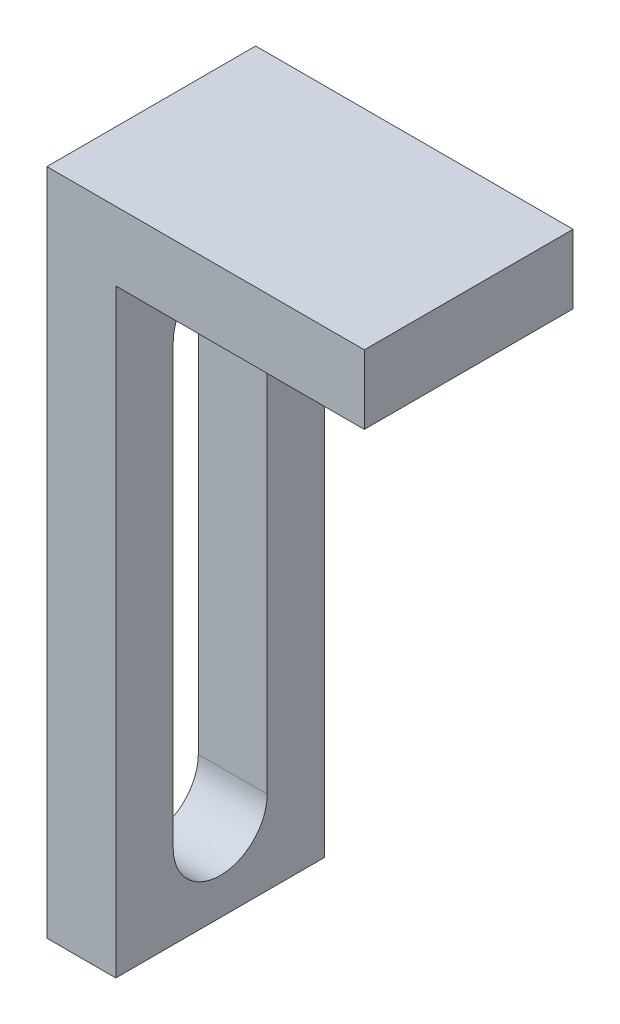
ISO-10303-21;
HEADER;
FILE_DESCRIPTION(('STEP AP214'),'2;1');
FILE_NAME('part.step','',(''),(''),'','','');
FILE_SCHEMA(('AUTOMOTIVE_DESIGN { 1 0 10303 214 1 1 1 1 }'));
ENDSEC;
DATA;
#1=APPLICATION_CONTEXT('core data for automotive mechanical design processes');
#2=APPLICATION_PROTOCOL_DEFINITION('international standard','automotive_design',2000,#1);
#3=PRODUCT_CONTEXT('',#1,'mechanical');
#4=PRODUCT('Part','Part','',(#3));
#5=PRODUCT_RELATED_PRODUCT_CATEGORY('part','',(#4));
#6=PRODUCT_DEFINITION_FORMATION('','',#4);
#7=PRODUCT_DEFINITION_CONTEXT('part definition',#1,'design');
#8=PRODUCT_DEFINITION('design','',#6,#7);
#9=PRODUCT_DEFINITION_SHAPE('','',#8);
#10=(LENGTH_UNIT() NAMED_UNIT(*) SI_UNIT(.MILLI.,.METRE.));
#11=(NAMED_UNIT(*) PLANE_ANGLE_UNIT() SI_UNIT($,.RADIAN.));
#12=(NAMED_UNIT(*) SI_UNIT($,.STERADIAN.) SOLID_ANGLE_UNIT());
#13=UNCERTAINTY_MEASURE_WITH_UNIT(LENGTH_MEASURE(1.E-05),#10,'distance_accuracy_value','');
#14=(GEOMETRIC_REPRESENTATION_CONTEXT(3) GLOBAL_UNCERTAINTY_ASSIGNED_CONTEXT((#13)) GLOBAL_UNIT_ASSIGNED_CONTEXT((#10,
#11,#12)) REPRESENTATION_CONTEXT('',''));
#15=CARTESIAN_POINT('',(0.,0.,0.));
#16=DIRECTION('',(0.,0.,1.));
#17=DIRECTION('',(1.,0.,0.));
#18=AXIS2_PLACEMENT_3D('',#15,#16,#17);
#19=CARTESIAN_POINT('',(-10.3050847457627,-21.6949152542373,10.));
#20=DIRECTION('',(-1.,0.,0.));
#21=DIRECTION('',(0.,0.,1.));
#22=AXIS2_PLACEMENT_3D('',#19,#20,#21);
#23=PLANE('',#22);
#24=CARTESIAN_POINT('',(-10.3050847457627,3.30508474576272,5.));
#25=DIRECTION('',(-1.,0.,0.));
#26=DIRECTION('',(0.,0.,1.));
#27=AXIS2_PLACEMENT_3D('',#24,#25,#26);
#28=CIRCLE('',#27,2.25);
#29=CARTESIAN_POINT('',(-10.3050847457627,3.30508474576272,7.25));
#30=VERTEX_POINT('',#29);
#31=CARTESIAN_POINT('',(-10.3050847457627,3.30508474576272,2.75));
#32=VERTEX_POINT('',#31);
#33=EDGE_CURVE('E58',#30,#32,#28,.T.);
#34=ORIENTED_EDGE('',*,*,#33,.F.);
#35=DIRECTION('',(0.,1.,0.));
#36=VECTOR('',#35,1.);
#37=CARTESIAN_POINT('',(-10.3050847457627,3.30508474576272,7.25));
#38=LINE('',#37,#36);
#39=CARTESIAN_POINT('',(-10.3050847457627,-17.6949152542373,7.25));
#40=VERTEX_POINT('',#39);
#41=EDGE_CURVE('E140',#40,#30,#38,.T.);
#42=ORIENTED_EDGE('',*,*,#41,.F.);
#43=CARTESIAN_POINT('',(-10.3050847457627,-17.6949152542373,5.));
#44=DIRECTION('',(-1.,0.,0.));
#45=DIRECTION('',(0.,0.,1.));
#46=AXIS2_PLACEMENT_3D('',#43,#44,#45);
#47=CIRCLE('',#46,2.25);
#48=CARTESIAN_POINT('',(-10.3050847457627,-17.6949152542373,2.75));
#49=VERTEX_POINT('',#48);
#50=EDGE_CURVE('E123',#49,#40,#47,.T.);
#51=ORIENTED_EDGE('',*,*,#50,.F.);
#52=DIRECTION('',(0.,-1.,0.));
#53=VECTOR('',#52,1.);
#54=CARTESIAN_POINT('',(-10.3050847457627,3.30508474576272,2.75));
#55=LINE('',#54,#53);
#56=EDGE_CURVE('E133',#32,#49,#55,.T.);
#57=ORIENTED_EDGE('',*,*,#56,.F.);
#58=EDGE_LOOP('',(#34,#42,#51,#57));
#59=FACE_BOUND('',#58,.T.);
#60=DIRECTION('',(0.,1.,0.));
#61=VECTOR('',#60,1.);
#62=CARTESIAN_POINT('',(-10.3050847457627,-21.6949152542373,0.));
#63=LINE('',#62,#61);
#64=CARTESIAN_POINT('',(-10.3050847457627,-21.6949152542373,0.));
#65=VERTEX_POINT('',#64);
#66=CARTESIAN_POINT('',(-10.3050847457627,10.3050847457627,0.));
#67=VERTEX_POINT('',#66);
#68=EDGE_CURVE('E150',#65,#67,#63,.T.);
#69=ORIENTED_EDGE('',*,*,#68,.F.);
#70=DIRECTION('',(0.,0.,-1.));
#71=VECTOR('',#70,1.);
#72=CARTESIAN_POINT('',(-10.3050847457627,-21.6949152542373,10.));
#73=LINE('',#72,#71);
#74=CARTESIAN_POINT('',(-10.3050847457627,-21.6949152542373,10.));
#75=VERTEX_POINT('',#74);
#76=EDGE_CURVE('E199',#75,#65,#73,.T.);
#77=ORIENTED_EDGE('',*,*,#76,.F.);
#78=DIRECTION('',(0.,1.,0.));
#79=VECTOR('',#78,1.);
#80=CARTESIAN_POINT('',(-10.3050847457627,-21.6949152542373,10.));
#81=LINE('',#80,#79);
#82=CARTESIAN_POINT('',(-10.3050847457627,10.3050847457627,10.));
#83=VERTEX_POINT('',#82);
#84=EDGE_CURVE('E155',#75,#83,#81,.T.);
#85=ORIENTED_EDGE('',*,*,#84,.T.);
#86=DIRECTION('',(0.,0.,-1.));
#87=VECTOR('',#86,1.);
#88=CARTESIAN_POINT('',(-10.3050847457627,10.3050847457627,10.));
#89=LINE('',#88,#87);
#90=EDGE_CURVE('E177',#83,#67,#89,.T.);
#91=ORIENTED_EDGE('',*,*,#90,.T.);
#92=EDGE_LOOP('',(#69,#77,#85,#91));
#93=FACE_BOUND('',#92,.T.);
#94=ADVANCED_FACE('F43',(#59,#93),#23,.T.);
#95=CARTESIAN_POINT('',(-10.3050847457627,-21.6949152542373,10.));
#96=DIRECTION('',(0.,1.,0.));
#97=DIRECTION('',(0.,0.,1.));
#98=AXIS2_PLACEMENT_3D('',#95,#96,#97);
#99=PLANE('',#98);
#100=DIRECTION('',(1.,0.,0.));
#101=VECTOR('',#100,1.);
#102=CARTESIAN_POINT('',(-10.3050847457627,-21.6949152542373,0.));
#103=LINE('',#102,#101);
#104=CARTESIAN_POINT('',(-7.00508474576271,-21.6949152542373,0.));
#105=VERTEX_POINT('',#104);
#106=EDGE_CURVE('E160',#65,#105,#103,.T.);
#107=ORIENTED_EDGE('',*,*,#106,.T.);
#108=DIRECTION('',(0.,0.,-1.));
#109=VECTOR('',#108,1.);
#110=CARTESIAN_POINT('',(-7.00508474576271,-21.6949152542373,10.));
#111=LINE('',#110,#109);
#112=CARTESIAN_POINT('',(-7.00508474576271,-21.6949152542373,10.));
#113=VERTEX_POINT('',#112);
#114=EDGE_CURVE('E203',#113,#105,#111,.T.);
#115=ORIENTED_EDGE('',*,*,#114,.F.);
#116=DIRECTION('',(1.,0.,0.));
#117=VECTOR('',#116,1.);
#118=CARTESIAN_POINT('',(-10.3050847457627,-21.6949152542373,10.));
#119=LINE('',#118,#117);
#120=EDGE_CURVE('E174',#75,#113,#119,.T.);
#121=ORIENTED_EDGE('',*,*,#120,.F.);
#122=ORIENTED_EDGE('',*,*,#76,.T.);
#123=EDGE_LOOP('',(#107,#115,#121,#122));
#124=FACE_BOUND('',#123,.T.);
#125=ADVANCED_FACE('F244',(#124),#99,.F.);
#126=CARTESIAN_POINT('',(-7.00508474576271,-21.6949152542373,10.));
#127=DIRECTION('',(-1.,0.,0.));
#128=DIRECTION('',(0.,-1.,0.));
#129=AXIS2_PLACEMENT_3D('',#126,#127,#128);
#130=PLANE('',#129);
#131=DIRECTION('',(0.,1.,0.));
#132=VECTOR('',#131,1.);
#133=CARTESIAN_POINT('',(-7.00508474576271,-21.6949152542373,7.25));
#134=LINE('',#133,#132);
#135=CARTESIAN_POINT('',(-7.00508474576271,-17.6949152542373,7.25));
#136=VERTEX_POINT('',#135);
#137=CARTESIAN_POINT('',(-7.00508474576271,3.30508474576272,7.25));
#138=VERTEX_POINT('',#137);
#139=EDGE_CURVE('E51',#136,#138,#134,.T.);
#140=ORIENTED_EDGE('',*,*,#139,.T.);
#141=CARTESIAN_POINT('',(-7.00508474576271,3.30508474576272,5.));
#142=DIRECTION('',(-1.,0.,0.));
#143=DIRECTION('',(0.,-1.,0.));
#144=AXIS2_PLACEMENT_3D('',#141,#142,#143);
#145=CIRCLE('',#144,2.25);
#146=CARTESIAN_POINT('',(-7.00508474576271,3.30508474576272,2.75));
#147=VERTEX_POINT('',#146);
#148=EDGE_CURVE('E11',#138,#147,#145,.T.);
#149=ORIENTED_EDGE('',*,*,#148,.T.);
#150=DIRECTION('',(0.,-1.,0.));
#151=VECTOR('',#150,1.);
#152=CARTESIAN_POINT('',(-7.00508474576271,-21.6949152542373,2.75));
#153=LINE('',#152,#151);
#154=CARTESIAN_POINT('',(-7.00508474576271,-17.6949152542373,2.75));
#155=VERTEX_POINT('',#154);
#156=EDGE_CURVE('E202',#147,#155,#153,.T.);
#157=ORIENTED_EDGE('',*,*,#156,.T.);
#158=CARTESIAN_POINT('',(-7.00508474576271,-17.6949152542373,5.));
#159=DIRECTION('',(-1.,0.,0.));
#160=DIRECTION('',(0.,-1.,0.));
#161=AXIS2_PLACEMENT_3D('',#158,#159,#160);
#162=CIRCLE('',#161,2.25);
#163=EDGE_CURVE('E126',#155,#136,#162,.T.);
#164=ORIENTED_EDGE('',*,*,#163,.T.);
#165=EDGE_LOOP('',(#140,#149,#157,#164));
#166=FACE_BOUND('',#165,.T.);
#167=DIRECTION('',(0.,1.,0.));
#168=VECTOR('',#167,1.);
#169=CARTESIAN_POINT('',(-7.00508474576271,-21.6949152542373,0.));
#170=LINE('',#169,#168);
#171=CARTESIAN_POINT('',(-7.00508474576271,7.00508474576271,0.));
#172=VERTEX_POINT('',#171);
#173=EDGE_CURVE('E193',#105,#172,#170,.T.);
#174=ORIENTED_EDGE('',*,*,#173,.T.);
#175=DIRECTION('',(0.,0.,-1.));
#176=VECTOR('',#175,1.);
#177=CARTESIAN_POINT('',(-7.00508474576271,7.00508474576271,10.));
#178=LINE('',#177,#176);
#179=CARTESIAN_POINT('',(-7.00508474576271,7.00508474576271,10.));
#180=VERTEX_POINT('',#179);
#181=EDGE_CURVE('E207',#180,#172,#178,.T.);
#182=ORIENTED_EDGE('',*,*,#181,.F.);
#183=DIRECTION('',(0.,1.,0.));
#184=VECTOR('',#183,1.);
#185=CARTESIAN_POINT('',(-7.00508474576271,-21.6949152542373,10.));
#186=LINE('',#185,#184);
#187=EDGE_CURVE('E171',#113,#180,#186,.T.);
#188=ORIENTED_EDGE('',*,*,#187,.F.);
#189=ORIENTED_EDGE('',*,*,#114,.T.);
#190=EDGE_LOOP('',(#174,#182,#188,#189));
#191=FACE_BOUND('',#190,.T.);
#192=ADVANCED_FACE('F224',(#166,#191),#130,.F.);
#193=CARTESIAN_POINT('',(4.89491525423729,7.00508474576271,10.));
#194=DIRECTION('',(0.,-1.,0.));
#195=DIRECTION('',(1.,0.,0.));
#196=AXIS2_PLACEMENT_3D('',#193,#194,#195);
#197=PLANE('',#196);
#198=DIRECTION('',(-1.,0.,0.));
#199=VECTOR('',#198,1.);
#200=CARTESIAN_POINT('',(4.89491525423729,7.00508474576271,0.));
#201=LINE('',#200,#199);
#202=CARTESIAN_POINT('',(4.89491525423729,7.00508474576271,0.));
#203=VERTEX_POINT('',#202);
#204=EDGE_CURVE('E189',#203,#172,#201,.T.);
#205=ORIENTED_EDGE('',*,*,#204,.F.);
#206=DIRECTION('',(0.,0.,-1.));
#207=VECTOR('',#206,1.);
#208=CARTESIAN_POINT('',(4.89491525423729,7.00508474576271,10.));
#209=LINE('',#208,#207);
#210=CARTESIAN_POINT('',(4.89491525423729,7.00508474576271,10.));
#211=VERTEX_POINT('',#210);
#212=EDGE_CURVE('E210',#211,#203,#209,.T.);
#213=ORIENTED_EDGE('',*,*,#212,.F.);
#214=DIRECTION('',(-1.,0.,0.));
#215=VECTOR('',#214,1.);
#216=CARTESIAN_POINT('',(4.89491525423729,7.00508474576271,10.));
#217=LINE('',#216,#215);
#218=EDGE_CURVE('E167',#211,#180,#217,.T.);
#219=ORIENTED_EDGE('',*,*,#218,.T.);
#220=ORIENTED_EDGE('',*,*,#181,.T.);
#221=EDGE_LOOP('',(#205,#213,#219,#220));
#222=FACE_BOUND('',#221,.T.);
#223=ADVANCED_FACE('F253',(#222),#197,.T.);
#224=CARTESIAN_POINT('',(4.89491525423729,7.00508474576271,10.));
#225=DIRECTION('',(-1.,0.,0.));
#226=DIRECTION('',(0.,0.,1.));
#227=AXIS2_PLACEMENT_3D('',#224,#225,#226);
#228=PLANE('',#227);
#229=DIRECTION('',(0.,1.,0.));
#230=VECTOR('',#229,1.);
#231=CARTESIAN_POINT('',(4.89491525423729,7.00508474576271,0.));
#232=LINE('',#231,#230);
#233=CARTESIAN_POINT('',(4.89491525423729,10.3050847457627,0.));
#234=VERTEX_POINT('',#233);
#235=EDGE_CURVE('E185',#203,#234,#232,.T.);
#236=ORIENTED_EDGE('',*,*,#235,.T.);
#237=DIRECTION('',(0.,0.,-1.));
#238=VECTOR('',#237,1.);
#239=CARTESIAN_POINT('',(4.89491525423729,10.3050847457627,10.));
#240=LINE('',#239,#238);
#241=CARTESIAN_POINT('',(4.89491525423729,10.3050847457627,10.));
#242=VERTEX_POINT('',#241);
#243=EDGE_CURVE('E213',#242,#234,#240,.T.);
#244=ORIENTED_EDGE('',*,*,#243,.F.);
#245=DIRECTION('',(0.,1.,0.));
#246=VECTOR('',#245,1.);
#247=CARTESIAN_POINT('',(4.89491525423729,7.00508474576271,10.));
#248=LINE('',#247,#246);
#249=EDGE_CURVE('E164',#211,#242,#248,.T.);
#250=ORIENTED_EDGE('',*,*,#249,.F.);
#251=ORIENTED_EDGE('',*,*,#212,.T.);
#252=EDGE_LOOP('',(#236,#244,#250,#251));
#253=FACE_BOUND('',#252,.T.);
#254=ADVANCED_FACE('F258',(#253),#228,.F.);
#255=CARTESIAN_POINT('',(-10.3050847457627,10.3050847457627,10.));
#256=DIRECTION('',(0.,1.,0.));
#257=DIRECTION('',(0.,0.,1.));
#258=AXIS2_PLACEMENT_3D('',#255,#256,#257);
#259=PLANE('',#258);
#260=DIRECTION('',(1.,0.,0.));
#261=VECTOR('',#260,1.);
#262=CARTESIAN_POINT('',(-10.3050847457627,10.3050847457627,0.));
#263=LINE('',#262,#261);
#264=EDGE_CURVE('E181',#67,#234,#263,.T.);
#265=ORIENTED_EDGE('',*,*,#264,.F.);
#266=ORIENTED_EDGE('',*,*,#90,.F.);
#267=DIRECTION('',(1.,0.,0.));
#268=VECTOR('',#267,1.);
#269=CARTESIAN_POINT('',(-10.3050847457627,10.3050847457627,10.));
#270=LINE('',#269,#268);
#271=EDGE_CURVE('E159',#83,#242,#270,.T.);
#272=ORIENTED_EDGE('',*,*,#271,.T.);
#273=ORIENTED_EDGE('',*,*,#243,.T.);
#274=EDGE_LOOP('',(#265,#266,#272,#273));
#275=FACE_BOUND('',#274,.T.);
#276=ADVANCED_FACE('F261',(#275),#259,.T.);
#277=CARTESIAN_POINT('',(0.,0.,10.));
#278=DIRECTION('',(0.,0.,-1.));
#279=DIRECTION('',(-1.,0.,0.));
#280=AXIS2_PLACEMENT_3D('',#277,#278,#279);
#281=PLANE('',#280);
#282=ORIENTED_EDGE('',*,*,#84,.F.);
#283=ORIENTED_EDGE('',*,*,#120,.T.);
#284=ORIENTED_EDGE('',*,*,#187,.T.);
#285=ORIENTED_EDGE('',*,*,#218,.F.);
#286=ORIENTED_EDGE('',*,*,#249,.T.);
#287=ORIENTED_EDGE('',*,*,#271,.F.);
#288=EDGE_LOOP('',(#282,#283,#284,#285,#286,#287));
#289=FACE_BOUND('',#288,.T.);
#290=ADVANCED_FACE('F238',(#289),#281,.F.);
#291=CARTESIAN_POINT('',(0.,0.,0.));
#292=DIRECTION('',(0.,0.,-1.));
#293=DIRECTION('',(-1.,0.,0.));
#294=AXIS2_PLACEMENT_3D('',#291,#292,#293);
#295=PLANE('',#294);
#296=ORIENTED_EDGE('',*,*,#68,.T.);
#297=ORIENTED_EDGE('',*,*,#264,.T.);
#298=ORIENTED_EDGE('',*,*,#235,.F.);
#299=ORIENTED_EDGE('',*,*,#204,.T.);
#300=ORIENTED_EDGE('',*,*,#173,.F.);
#301=ORIENTED_EDGE('',*,*,#106,.F.);
#302=EDGE_LOOP('',(#296,#297,#298,#299,#300,#301));
#303=FACE_BOUND('',#302,.T.);
#304=ADVANCED_FACE('F231',(#303),#295,.T.);
#305=CARTESIAN_POINT('',(-4.30508474576271,3.30508474576272,5.));
#306=DIRECTION('',(-1.,0.,0.));
#307=DIRECTION('',(0.,0.,1.));
#308=AXIS2_PLACEMENT_3D('',#305,#306,#307);
#309=CYLINDRICAL_SURFACE('',#308,2.25);
#310=DIRECTION('',(-1.,0.,0.));
#311=VECTOR('',#310,1.);
#312=CARTESIAN_POINT('',(-4.30508474576271,3.30508474576272,7.25));
#313=LINE('',#312,#311);
#314=EDGE_CURVE('E147',#138,#30,#313,.T.);
#315=ORIENTED_EDGE('',*,*,#314,.T.);
#316=ORIENTED_EDGE('',*,*,#33,.T.);
#317=DIRECTION('',(-1.,0.,0.));
#318=VECTOR('',#317,1.);
#319=CARTESIAN_POINT('',(-4.30508474576271,3.30508474576272,2.75));
#320=LINE('',#319,#318);
#321=EDGE_CURVE('E130',#147,#32,#320,.T.);
#322=ORIENTED_EDGE('',*,*,#321,.F.);
#323=ORIENTED_EDGE('',*,*,#148,.F.);
#324=EDGE_LOOP('',(#315,#316,#322,#323));
#325=FACE_BOUND('',#324,.T.);
#326=ADVANCED_FACE('F229',(#325),#309,.F.);
#327=CARTESIAN_POINT('',(-4.30508474576271,3.30508474576272,7.25));
#328=DIRECTION('',(0.,0.,1.));
#329=DIRECTION('',(0.,-1.,0.));
#330=AXIS2_PLACEMENT_3D('',#327,#328,#329);
#331=PLANE('',#330);
#332=DIRECTION('',(-1.,0.,0.));
#333=VECTOR('',#332,1.);
#334=CARTESIAN_POINT('',(-4.30508474576271,-17.6949152542373,7.25));
#335=LINE('',#334,#333);
#336=EDGE_CURVE('E129',#136,#40,#335,.T.);
#337=ORIENTED_EDGE('',*,*,#336,.T.);
#338=ORIENTED_EDGE('',*,*,#41,.T.);
#339=ORIENTED_EDGE('',*,*,#314,.F.);
#340=ORIENTED_EDGE('',*,*,#139,.F.);
#341=EDGE_LOOP('',(#337,#338,#339,#340));
#342=FACE_BOUND('',#341,.T.);
#343=ADVANCED_FACE('F228',(#342),#331,.F.);
#344=CARTESIAN_POINT('',(-4.30508474576271,-17.6949152542373,5.));
#345=DIRECTION('',(-1.,0.,0.));
#346=DIRECTION('',(0.,0.,1.));
#347=AXIS2_PLACEMENT_3D('',#344,#345,#346);
#348=CYLINDRICAL_SURFACE('',#347,2.25);
#349=DIRECTION('',(-1.,0.,0.));
#350=VECTOR('',#349,1.);
#351=CARTESIAN_POINT('',(-4.30508474576271,-17.6949152542373,2.75));
#352=LINE('',#351,#350);
#353=EDGE_CURVE('E66',#155,#49,#352,.T.);
#354=ORIENTED_EDGE('',*,*,#353,.T.);
#355=ORIENTED_EDGE('',*,*,#50,.T.);
#356=ORIENTED_EDGE('',*,*,#336,.F.);
#357=ORIENTED_EDGE('',*,*,#163,.F.);
#358=EDGE_LOOP('',(#354,#355,#356,#357));
#359=FACE_BOUND('',#358,.T.);
#360=ADVANCED_FACE('F120',(#359),#348,.F.);
#361=CARTESIAN_POINT('',(-4.30508474576271,3.30508474576272,2.75));
#362=DIRECTION('',(0.,0.,-1.));
#363=DIRECTION('',(0.,1.,0.));
#364=AXIS2_PLACEMENT_3D('',#361,#362,#363);
#365=PLANE('',#364);
#366=ORIENTED_EDGE('',*,*,#321,.T.);
#367=ORIENTED_EDGE('',*,*,#56,.T.);
#368=ORIENTED_EDGE('',*,*,#353,.F.);
#369=ORIENTED_EDGE('',*,*,#156,.F.);
#370=EDGE_LOOP('',(#366,#367,#368,#369));
#371=FACE_BOUND('',#370,.T.);
#372=ADVANCED_FACE('F134',(#371),#365,.F.);
#373=CLOSED_SHELL('',(#94,#125,#192,#223,#254,#276,#290,#304,#326,#343,#360,#372));
#374=MANIFOLD_SOLID_BREP('B2',#373);
#375=ADVANCED_BREP_SHAPE_REPRESENTATION('',(#18,#374),#14);
#376=SHAPE_DEFINITION_REPRESENTATION(#9,#375);
ENDSEC;
END-ISO-10303-21;
